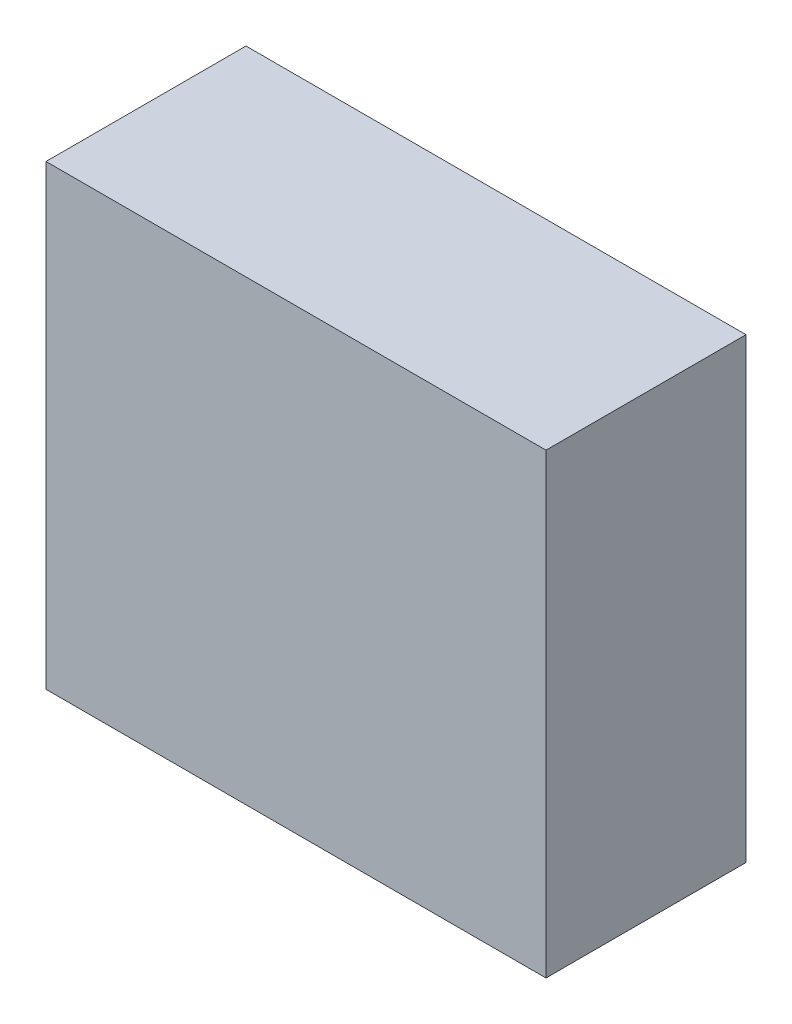
ISO-10303-21;
HEADER;
FILE_DESCRIPTION(('STEP AP214'),'2;1');
FILE_NAME('part.step','',(''),(''),'','','');
FILE_SCHEMA(('AUTOMOTIVE_DESIGN { 1 0 10303 214 1 1 1 1 }'));
ENDSEC;
DATA;
#1=APPLICATION_CONTEXT('core data for automotive mechanical design processes');
#2=APPLICATION_PROTOCOL_DEFINITION('international standard','automotive_design',2000,#1);
#3=PRODUCT_CONTEXT('',#1,'mechanical');
#4=PRODUCT('Part','Part','',(#3));
#5=PRODUCT_RELATED_PRODUCT_CATEGORY('part','',(#4));
#6=PRODUCT_DEFINITION_FORMATION('','',#4);
#7=PRODUCT_DEFINITION_CONTEXT('part definition',#1,'design');
#8=PRODUCT_DEFINITION('design','',#6,#7);
#9=PRODUCT_DEFINITION_SHAPE('','',#8);
#10=(LENGTH_UNIT() NAMED_UNIT(*) SI_UNIT(.MILLI.,.METRE.));
#11=(NAMED_UNIT(*) PLANE_ANGLE_UNIT() SI_UNIT($,.RADIAN.));
#12=(NAMED_UNIT(*) SI_UNIT($,.STERADIAN.) SOLID_ANGLE_UNIT());
#13=UNCERTAINTY_MEASURE_WITH_UNIT(LENGTH_MEASURE(1.E-05),#10,'distance_accuracy_value','');
#14=(GEOMETRIC_REPRESENTATION_CONTEXT(3) GLOBAL_UNCERTAINTY_ASSIGNED_CONTEXT((#13)) GLOBAL_UNIT_ASSIGNED_CONTEXT((#10,
#11,#12)) REPRESENTATION_CONTEXT('',''));
#15=CARTESIAN_POINT('',(0.,0.,0.));
#16=DIRECTION('',(0.,0.,1.));
#17=DIRECTION('',(1.,0.,0.));
#18=AXIS2_PLACEMENT_3D('',#15,#16,#17);
#19=CARTESIAN_POINT('',(-1.75,-1.6,1.4));
#20=DIRECTION('',(1.,0.,0.));
#21=DIRECTION('',(0.,0.,-1.));
#22=AXIS2_PLACEMENT_3D('',#19,#20,#21);
#23=PLANE('',#22);
#24=DIRECTION('',(0.,-1.,0.));
#25=VECTOR('',#24,1.);
#26=CARTESIAN_POINT('',(-1.75,-1.6,0.));
#27=LINE('',#26,#25);
#28=CARTESIAN_POINT('',(-1.75,1.6,0.));
#29=VERTEX_POINT('',#28);
#30=CARTESIAN_POINT('',(-1.75,-1.6,0.));
#31=VERTEX_POINT('',#30);
#32=EDGE_CURVE('E97',#29,#31,#27,.T.);
#33=ORIENTED_EDGE('',*,*,#32,.T.);
#34=DIRECTION('',(0.,0.,-1.));
#35=VECTOR('',#34,1.);
#36=CARTESIAN_POINT('',(-1.75,-1.6,1.4));
#37=LINE('',#36,#35);
#38=CARTESIAN_POINT('',(-1.75,-1.6,1.4));
#39=VERTEX_POINT('',#38);
#40=EDGE_CURVE('E11',#39,#31,#37,.T.);
#41=ORIENTED_EDGE('',*,*,#40,.F.);
#42=DIRECTION('',(0.,-1.,0.));
#43=VECTOR('',#42,1.);
#44=CARTESIAN_POINT('',(-1.75,-1.6,1.4));
#45=LINE('',#44,#43);
#46=CARTESIAN_POINT('',(-1.75,1.6,1.4));
#47=VERTEX_POINT('',#46);
#48=EDGE_CURVE('E85',#47,#39,#45,.T.);
#49=ORIENTED_EDGE('',*,*,#48,.F.);
#50=DIRECTION('',(0.,0.,-1.));
#51=VECTOR('',#50,1.);
#52=CARTESIAN_POINT('',(-1.75,1.6,1.4));
#53=LINE('',#52,#51);
#54=EDGE_CURVE('E93',#47,#29,#53,.T.);
#55=ORIENTED_EDGE('',*,*,#54,.T.);
#56=EDGE_LOOP('',(#33,#41,#49,#55));
#57=FACE_BOUND('',#56,.T.);
#58=ADVANCED_FACE('F34',(#57),#23,.F.);
#59=CARTESIAN_POINT('',(1.75,-1.6,1.4));
#60=DIRECTION('',(0.,1.,0.));
#61=DIRECTION('',(0.,0.,1.));
#62=AXIS2_PLACEMENT_3D('',#59,#60,#61);
#63=PLANE('',#62);
#64=DIRECTION('',(1.,0.,0.));
#65=VECTOR('',#64,1.);
#66=CARTESIAN_POINT('',(1.75,-1.6,0.));
#67=LINE('',#66,#65);
#68=CARTESIAN_POINT('',(1.75,-1.6,0.));
#69=VERTEX_POINT('',#68);
#70=EDGE_CURVE('E89',#31,#69,#67,.T.);
#71=ORIENTED_EDGE('',*,*,#70,.T.);
#72=DIRECTION('',(0.,0.,-1.));
#73=VECTOR('',#72,1.);
#74=CARTESIAN_POINT('',(1.75,-1.6,1.4));
#75=LINE('',#74,#73);
#76=CARTESIAN_POINT('',(1.75,-1.6,1.4));
#77=VERTEX_POINT('',#76);
#78=EDGE_CURVE('E42',#77,#69,#75,.T.);
#79=ORIENTED_EDGE('',*,*,#78,.F.);
#80=DIRECTION('',(1.,0.,0.));
#81=VECTOR('',#80,1.);
#82=CARTESIAN_POINT('',(1.75,-1.6,1.4));
#83=LINE('',#82,#81);
#84=EDGE_CURVE('E80',#39,#77,#83,.T.);
#85=ORIENTED_EDGE('',*,*,#84,.F.);
#86=ORIENTED_EDGE('',*,*,#40,.T.);
#87=EDGE_LOOP('',(#71,#79,#85,#86));
#88=FACE_BOUND('',#87,.T.);
#89=ADVANCED_FACE('F88',(#88),#63,.F.);
#90=CARTESIAN_POINT('',(1.75,1.6,1.4));
#91=DIRECTION('',(-1.,0.,0.));
#92=DIRECTION('',(0.,0.,1.));
#93=AXIS2_PLACEMENT_3D('',#90,#91,#92);
#94=PLANE('',#93);
#95=DIRECTION('',(0.,1.,0.));
#96=VECTOR('',#95,1.);
#97=CARTESIAN_POINT('',(1.75,1.6,0.));
#98=LINE('',#97,#96);
#99=CARTESIAN_POINT('',(1.75,1.6,0.));
#100=VERTEX_POINT('',#99);
#101=EDGE_CURVE('E67',#69,#100,#98,.T.);
#102=ORIENTED_EDGE('',*,*,#101,.T.);
#103=DIRECTION('',(0.,0.,-1.));
#104=VECTOR('',#103,1.);
#105=CARTESIAN_POINT('',(1.75,1.6,1.4));
#106=LINE('',#105,#104);
#107=CARTESIAN_POINT('',(1.75,1.6,1.4));
#108=VERTEX_POINT('',#107);
#109=EDGE_CURVE('E90',#108,#100,#106,.T.);
#110=ORIENTED_EDGE('',*,*,#109,.F.);
#111=DIRECTION('',(0.,1.,0.));
#112=VECTOR('',#111,1.);
#113=CARTESIAN_POINT('',(1.75,1.6,1.4));
#114=LINE('',#113,#112);
#115=EDGE_CURVE('E83',#77,#108,#114,.T.);
#116=ORIENTED_EDGE('',*,*,#115,.F.);
#117=ORIENTED_EDGE('',*,*,#78,.T.);
#118=EDGE_LOOP('',(#102,#110,#116,#117));
#119=FACE_BOUND('',#118,.T.);
#120=ADVANCED_FACE('F91',(#119),#94,.F.);
#121=CARTESIAN_POINT('',(-1.75,1.6,1.4));
#122=DIRECTION('',(0.,-1.,0.));
#123=DIRECTION('',(0.,0.,-1.));
#124=AXIS2_PLACEMENT_3D('',#121,#122,#123);
#125=PLANE('',#124);
#126=DIRECTION('',(-1.,0.,0.));
#127=VECTOR('',#126,1.);
#128=CARTESIAN_POINT('',(-1.75,1.6,0.));
#129=LINE('',#128,#127);
#130=EDGE_CURVE('E73',#100,#29,#129,.T.);
#131=ORIENTED_EDGE('',*,*,#130,.T.);
#132=ORIENTED_EDGE('',*,*,#54,.F.);
#133=DIRECTION('',(-1.,0.,0.));
#134=VECTOR('',#133,1.);
#135=CARTESIAN_POINT('',(-1.75,1.6,1.4));
#136=LINE('',#135,#134);
#137=EDGE_CURVE('E50',#108,#47,#136,.T.);
#138=ORIENTED_EDGE('',*,*,#137,.F.);
#139=ORIENTED_EDGE('',*,*,#109,.T.);
#140=EDGE_LOOP('',(#131,#132,#138,#139));
#141=FACE_BOUND('',#140,.T.);
#142=ADVANCED_FACE('F104',(#141),#125,.F.);
#143=CARTESIAN_POINT('',(0.,0.,1.4));
#144=DIRECTION('',(0.,0.,-1.));
#145=DIRECTION('',(-1.,0.,0.));
#146=AXIS2_PLACEMENT_3D('',#143,#144,#145);
#147=PLANE('',#146);
#148=ORIENTED_EDGE('',*,*,#48,.T.);
#149=ORIENTED_EDGE('',*,*,#84,.T.);
#150=ORIENTED_EDGE('',*,*,#115,.T.);
#151=ORIENTED_EDGE('',*,*,#137,.T.);
#152=EDGE_LOOP('',(#148,#149,#150,#151));
#153=FACE_BOUND('',#152,.T.);
#154=ADVANCED_FACE('F81',(#153),#147,.F.);
#155=CARTESIAN_POINT('',(0.,0.,0.));
#156=DIRECTION('',(0.,0.,-1.));
#157=DIRECTION('',(-1.,0.,0.));
#158=AXIS2_PLACEMENT_3D('',#155,#156,#157);
#159=PLANE('',#158);
#160=ORIENTED_EDGE('',*,*,#32,.F.);
#161=ORIENTED_EDGE('',*,*,#130,.F.);
#162=ORIENTED_EDGE('',*,*,#101,.F.);
#163=ORIENTED_EDGE('',*,*,#70,.F.);
#164=EDGE_LOOP('',(#160,#161,#162,#163));
#165=FACE_BOUND('',#164,.T.);
#166=ADVANCED_FACE('F107',(#165),#159,.T.);
#167=CLOSED_SHELL('',(#58,#89,#120,#142,#154,#166));
#168=MANIFOLD_SOLID_BREP('B2',#167);
#169=ADVANCED_BREP_SHAPE_REPRESENTATION('',(#18,#168),#14);
#170=SHAPE_DEFINITION_REPRESENTATION(#9,#169);
ENDSEC;
END-ISO-10303-21;
